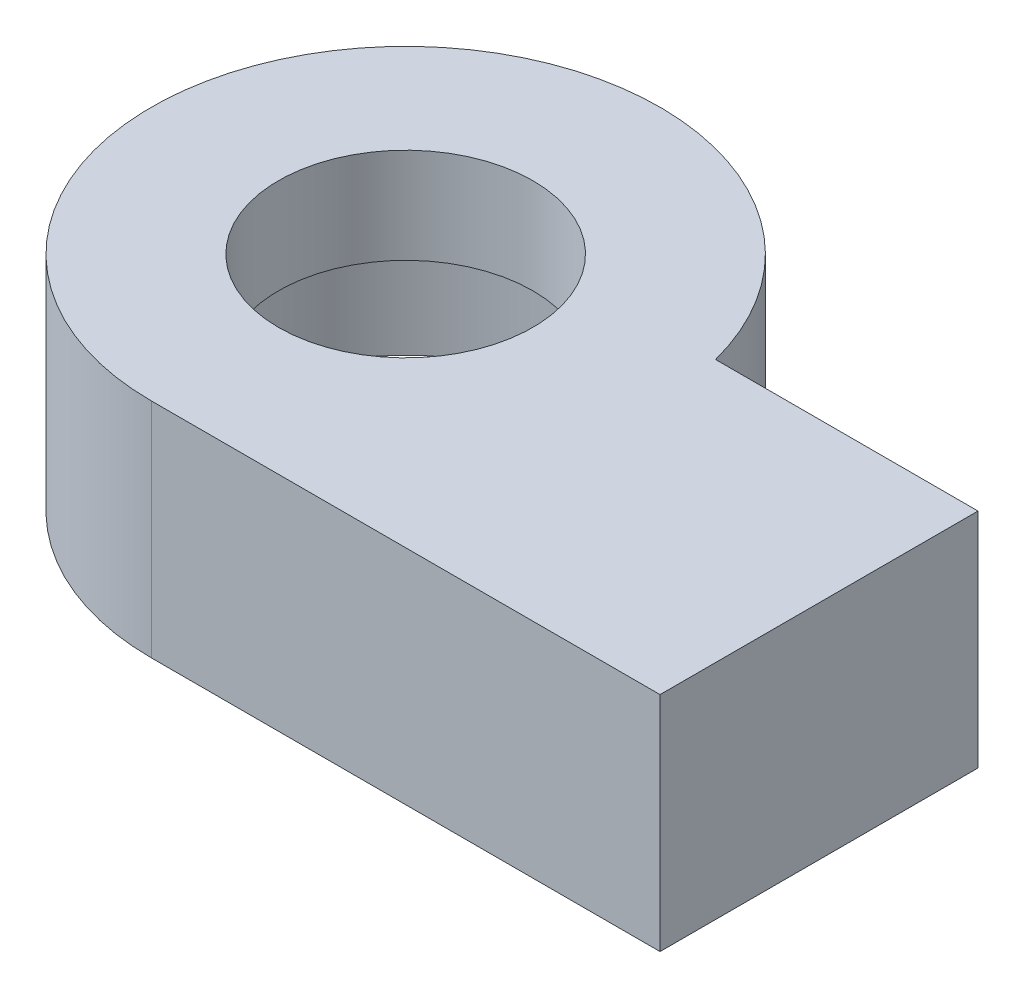
ISO-10303-21;
HEADER;
FILE_DESCRIPTION(('STEP AP214'),'2;1');
FILE_NAME('part.step','',(''),(''),'','','');
FILE_SCHEMA(('AUTOMOTIVE_DESIGN { 1 0 10303 214 1 1 1 1 }'));
ENDSEC;
DATA;
#1=APPLICATION_CONTEXT('core data for automotive mechanical design processes');
#2=APPLICATION_PROTOCOL_DEFINITION('international standard','automotive_design',2000,#1);
#3=PRODUCT_CONTEXT('',#1,'mechanical');
#4=PRODUCT('Part','Part','',(#3));
#5=PRODUCT_RELATED_PRODUCT_CATEGORY('part','',(#4));
#6=PRODUCT_DEFINITION_FORMATION('','',#4);
#7=PRODUCT_DEFINITION_CONTEXT('part definition',#1,'design');
#8=PRODUCT_DEFINITION('design','',#6,#7);
#9=PRODUCT_DEFINITION_SHAPE('','',#8);
#10=(LENGTH_UNIT() NAMED_UNIT(*) SI_UNIT(.MILLI.,.METRE.));
#11=(NAMED_UNIT(*) PLANE_ANGLE_UNIT() SI_UNIT($,.RADIAN.));
#12=(NAMED_UNIT(*) SI_UNIT($,.STERADIAN.) SOLID_ANGLE_UNIT());
#13=UNCERTAINTY_MEASURE_WITH_UNIT(LENGTH_MEASURE(1.E-05),#10,'distance_accuracy_value','');
#14=(GEOMETRIC_REPRESENTATION_CONTEXT(3) GLOBAL_UNCERTAINTY_ASSIGNED_CONTEXT((#13)) GLOBAL_UNIT_ASSIGNED_CONTEXT((#10,
#11,#12)) REPRESENTATION_CONTEXT('',''));
#15=CARTESIAN_POINT('',(0.,0.,0.));
#16=DIRECTION('',(0.,0.,1.));
#17=DIRECTION('',(1.,0.,0.));
#18=AXIS2_PLACEMENT_3D('',#15,#16,#17);
#19=CARTESIAN_POINT('',(0.,3.5,0.));
#20=DIRECTION('',(0.,-1.,0.));
#21=DIRECTION('',(0.,0.,-1.));
#22=AXIS2_PLACEMENT_3D('',#19,#20,#21);
#23=CYLINDRICAL_SURFACE('',#22,4.);
#24=CARTESIAN_POINT('',(0.,0.,0.));
#25=DIRECTION('',(0.,1.,0.));
#26=DIRECTION('',(0.,0.,1.));
#27=AXIS2_PLACEMENT_3D('',#24,#25,#26);
#28=CIRCLE('',#27,4.);
#29=CARTESIAN_POINT('',(3.87298334620742,0.,-1.));
#30=VERTEX_POINT('',#29);
#31=CARTESIAN_POINT('',(0.,0.,4.));
#32=VERTEX_POINT('',#31);
#33=EDGE_CURVE('E95',#30,#32,#28,.T.);
#34=ORIENTED_EDGE('',*,*,#33,.T.);
#35=DIRECTION('',(0.,-1.,0.));
#36=VECTOR('',#35,1.);
#37=CARTESIAN_POINT('',(0.,3.5,4.));
#38=LINE('',#37,#36);
#39=CARTESIAN_POINT('',(0.,3.5,4.));
#40=VERTEX_POINT('',#39);
#41=EDGE_CURVE('E11',#40,#32,#38,.T.);
#42=ORIENTED_EDGE('',*,*,#41,.F.);
#43=CARTESIAN_POINT('',(0.,3.5,0.));
#44=DIRECTION('',(0.,1.,0.));
#45=DIRECTION('',(0.,0.,1.));
#46=AXIS2_PLACEMENT_3D('',#43,#44,#45);
#47=CIRCLE('',#46,4.);
#48=CARTESIAN_POINT('',(3.87298334620742,3.5,-1.));
#49=VERTEX_POINT('',#48);
#50=EDGE_CURVE('E83',#49,#40,#47,.T.);
#51=ORIENTED_EDGE('',*,*,#50,.F.);
#52=DIRECTION('',(0.,-1.,0.));
#53=VECTOR('',#52,1.);
#54=CARTESIAN_POINT('',(3.87298334620742,3.5,-1.));
#55=LINE('',#54,#53);
#56=EDGE_CURVE('E91',#49,#30,#55,.T.);
#57=ORIENTED_EDGE('',*,*,#56,.T.);
#58=EDGE_LOOP('',(#34,#42,#51,#57));
#59=FACE_BOUND('',#58,.T.);
#60=ADVANCED_FACE('F32',(#59),#23,.T.);
#61=CARTESIAN_POINT('',(0.,3.5,4.));
#62=DIRECTION('',(0.,0.,-1.));
#63=DIRECTION('',(-1.,0.,0.));
#64=AXIS2_PLACEMENT_3D('',#61,#62,#63);
#65=PLANE('',#64);
#66=DIRECTION('',(1.,0.,0.));
#67=VECTOR('',#66,1.);
#68=CARTESIAN_POINT('',(0.,0.,4.));
#69=LINE('',#68,#67);
#70=CARTESIAN_POINT('',(8.,0.,4.));
#71=VERTEX_POINT('',#70);
#72=EDGE_CURVE('E87',#32,#71,#69,.T.);
#73=ORIENTED_EDGE('',*,*,#72,.T.);
#74=DIRECTION('',(0.,-1.,0.));
#75=VECTOR('',#74,1.);
#76=CARTESIAN_POINT('',(8.,3.5,4.));
#77=LINE('',#76,#75);
#78=CARTESIAN_POINT('',(8.,3.5,4.));
#79=VERTEX_POINT('',#78);
#80=EDGE_CURVE('E40',#79,#71,#77,.T.);
#81=ORIENTED_EDGE('',*,*,#80,.F.);
#82=DIRECTION('',(1.,0.,0.));
#83=VECTOR('',#82,1.);
#84=CARTESIAN_POINT('',(0.,3.5,4.));
#85=LINE('',#84,#83);
#86=EDGE_CURVE('E78',#40,#79,#85,.T.);
#87=ORIENTED_EDGE('',*,*,#86,.F.);
#88=ORIENTED_EDGE('',*,*,#41,.T.);
#89=EDGE_LOOP('',(#73,#81,#87,#88));
#90=FACE_BOUND('',#89,.T.);
#91=ADVANCED_FACE('F86',(#90),#65,.F.);
#92=CARTESIAN_POINT('',(8.,3.5,-1.));
#93=DIRECTION('',(-1.,0.,0.));
#94=DIRECTION('',(0.,0.,1.));
#95=AXIS2_PLACEMENT_3D('',#92,#93,#94);
#96=PLANE('',#95);
#97=DIRECTION('',(0.,0.,-1.));
#98=VECTOR('',#97,1.);
#99=CARTESIAN_POINT('',(8.,0.,-1.));
#100=LINE('',#99,#98);
#101=CARTESIAN_POINT('',(8.,0.,-1.));
#102=VERTEX_POINT('',#101);
#103=EDGE_CURVE('E65',#71,#102,#100,.T.);
#104=ORIENTED_EDGE('',*,*,#103,.T.);
#105=DIRECTION('',(0.,-1.,0.));
#106=VECTOR('',#105,1.);
#107=CARTESIAN_POINT('',(8.,3.5,-1.));
#108=LINE('',#107,#106);
#109=CARTESIAN_POINT('',(8.,3.5,-1.));
#110=VERTEX_POINT('',#109);
#111=EDGE_CURVE('E88',#110,#102,#108,.T.);
#112=ORIENTED_EDGE('',*,*,#111,.F.);
#113=DIRECTION('',(0.,0.,-1.));
#114=VECTOR('',#113,1.);
#115=CARTESIAN_POINT('',(8.,3.5,-1.));
#116=LINE('',#115,#114);
#117=EDGE_CURVE('E81',#79,#110,#116,.T.);
#118=ORIENTED_EDGE('',*,*,#117,.F.);
#119=ORIENTED_EDGE('',*,*,#80,.T.);
#120=EDGE_LOOP('',(#104,#112,#118,#119));
#121=FACE_BOUND('',#120,.T.);
#122=ADVANCED_FACE('F89',(#121),#96,.F.);
#123=CARTESIAN_POINT('',(3.87298334620742,3.5,-1.));
#124=DIRECTION('',(0.,0.,1.));
#125=DIRECTION('',(1.,0.,0.));
#126=AXIS2_PLACEMENT_3D('',#123,#124,#125);
#127=PLANE('',#126);
#128=DIRECTION('',(-1.,0.,0.));
#129=VECTOR('',#128,1.);
#130=CARTESIAN_POINT('',(3.87298334620742,0.,-1.));
#131=LINE('',#130,#129);
#132=EDGE_CURVE('E71',#102,#30,#131,.T.);
#133=ORIENTED_EDGE('',*,*,#132,.T.);
#134=ORIENTED_EDGE('',*,*,#56,.F.);
#135=DIRECTION('',(-1.,0.,0.));
#136=VECTOR('',#135,1.);
#137=CARTESIAN_POINT('',(3.87298334620742,3.5,-1.));
#138=LINE('',#137,#136);
#139=EDGE_CURVE('E48',#110,#49,#138,.T.);
#140=ORIENTED_EDGE('',*,*,#139,.F.);
#141=ORIENTED_EDGE('',*,*,#111,.T.);
#142=EDGE_LOOP('',(#133,#134,#140,#141));
#143=FACE_BOUND('',#142,.T.);
#144=ADVANCED_FACE('F103',(#143),#127,.F.);
#145=CARTESIAN_POINT('',(0.,3.5,0.));
#146=DIRECTION('',(0.,1.,0.));
#147=DIRECTION('',(0.,0.,1.));
#148=AXIS2_PLACEMENT_3D('',#145,#146,#147);
#149=PLANE('',#148);
#150=CARTESIAN_POINT('',(0.,3.5,0.));
#151=DIRECTION('',(0.,-1.,0.));
#152=DIRECTION('',(0.,0.,-1.));
#153=AXIS2_PLACEMENT_3D('',#150,#151,#152);
#154=CIRCLE('',#153,2.);
#155=CARTESIAN_POINT('',(0.,3.5,-2.));
#156=VERTEX_POINT('',#155);
#157=EDGE_CURVE('E112',#156,#156,#154,.T.);
#158=ORIENTED_EDGE('',*,*,#157,.T.);
#159=EDGE_LOOP('',(#158));
#160=FACE_BOUND('',#159,.T.);
#161=ORIENTED_EDGE('',*,*,#50,.T.);
#162=ORIENTED_EDGE('',*,*,#86,.T.);
#163=ORIENTED_EDGE('',*,*,#117,.T.);
#164=ORIENTED_EDGE('',*,*,#139,.T.);
#165=EDGE_LOOP('',(#161,#162,#163,#164));
#166=FACE_BOUND('',#165,.T.);
#167=ADVANCED_FACE('F79',(#160,#166),#149,.T.);
#168=CARTESIAN_POINT('',(0.,0.,0.));
#169=DIRECTION('',(0.,1.,0.));
#170=DIRECTION('',(0.,0.,1.));
#171=AXIS2_PLACEMENT_3D('',#168,#169,#170);
#172=PLANE('',#171);
#173=CARTESIAN_POINT('',(0.,0.,0.));
#174=DIRECTION('',(0.,-1.,0.));
#175=DIRECTION('',(0.,0.,-1.));
#176=AXIS2_PLACEMENT_3D('',#173,#174,#175);
#177=CIRCLE('',#176,3.);
#178=CARTESIAN_POINT('',(0.,0.,-3.));
#179=VERTEX_POINT('',#178);
#180=EDGE_CURVE('E109',#179,#179,#177,.T.);
#181=ORIENTED_EDGE('',*,*,#180,.F.);
#182=EDGE_LOOP('',(#181));
#183=FACE_BOUND('',#182,.T.);
#184=ORIENTED_EDGE('',*,*,#33,.F.);
#185=ORIENTED_EDGE('',*,*,#132,.F.);
#186=ORIENTED_EDGE('',*,*,#103,.F.);
#187=ORIENTED_EDGE('',*,*,#72,.F.);
#188=EDGE_LOOP('',(#184,#185,#186,#187));
#189=FACE_BOUND('',#188,.T.);
#190=ADVANCED_FACE('F106',(#183,#189),#172,.F.);
#191=CARTESIAN_POINT('',(0.,2.,0.));
#192=DIRECTION('',(0.,-1.,0.));
#193=DIRECTION('',(0.,0.,-1.));
#194=AXIS2_PLACEMENT_3D('',#191,#192,#193);
#195=CYLINDRICAL_SURFACE('',#194,3.);
#196=CARTESIAN_POINT('',(0.,2.,0.));
#197=DIRECTION('',(0.,-1.,0.));
#198=DIRECTION('',(0.,0.,-1.));
#199=AXIS2_PLACEMENT_3D('',#196,#197,#198);
#200=CIRCLE('',#199,3.);
#201=CARTESIAN_POINT('',(0.,2.,-3.));
#202=VERTEX_POINT('',#201);
#203=EDGE_CURVE('E98',#202,#202,#200,.T.);
#204=ORIENTED_EDGE('',*,*,#203,.F.);
#205=EDGE_LOOP('',(#204));
#206=FACE_BOUND('',#205,.T.);
#207=ORIENTED_EDGE('',*,*,#180,.T.);
#208=EDGE_LOOP('',(#207));
#209=FACE_BOUND('',#208,.T.);
#210=ADVANCED_FACE('F131',(#206,#209),#195,.F.);
#211=CARTESIAN_POINT('',(0.,2.,0.));
#212=DIRECTION('',(0.,-1.,0.));
#213=DIRECTION('',(0.,0.,-1.));
#214=AXIS2_PLACEMENT_3D('',#211,#212,#213);
#215=PLANE('',#214);
#216=CARTESIAN_POINT('',(0.,2.,0.));
#217=DIRECTION('',(0.,-1.,0.));
#218=DIRECTION('',(0.,0.,-1.));
#219=AXIS2_PLACEMENT_3D('',#216,#217,#218);
#220=CIRCLE('',#219,2.);
#221=CARTESIAN_POINT('',(0.,2.,-2.));
#222=VERTEX_POINT('',#221);
#223=EDGE_CURVE('E115',#222,#222,#220,.T.);
#224=ORIENTED_EDGE('',*,*,#223,.F.);
#225=EDGE_LOOP('',(#224));
#226=FACE_BOUND('',#225,.T.);
#227=ORIENTED_EDGE('',*,*,#203,.T.);
#228=EDGE_LOOP('',(#227));
#229=FACE_BOUND('',#228,.T.);
#230=ADVANCED_FACE('F125',(#226,#229),#215,.T.);
#231=CARTESIAN_POINT('',(0.,3.5,0.));
#232=DIRECTION('',(0.,-1.,0.));
#233=DIRECTION('',(0.,0.,-1.));
#234=AXIS2_PLACEMENT_3D('',#231,#232,#233);
#235=CYLINDRICAL_SURFACE('',#234,2.);
#236=ORIENTED_EDGE('',*,*,#157,.F.);
#237=EDGE_LOOP('',(#236));
#238=FACE_BOUND('',#237,.T.);
#239=ORIENTED_EDGE('',*,*,#223,.T.);
#240=EDGE_LOOP('',(#239));
#241=FACE_BOUND('',#240,.T.);
#242=ADVANCED_FACE('F122',(#238,#241),#235,.F.);
#243=CLOSED_SHELL('',(#60,#91,#122,#144,#167,#190,#210,#230,#242));
#244=MANIFOLD_SOLID_BREP('B2',#243);
#245=ADVANCED_BREP_SHAPE_REPRESENTATION('',(#18,#244),#14);
#246=SHAPE_DEFINITION_REPRESENTATION(#9,#245);
ENDSEC;
END-ISO-10303-21;
